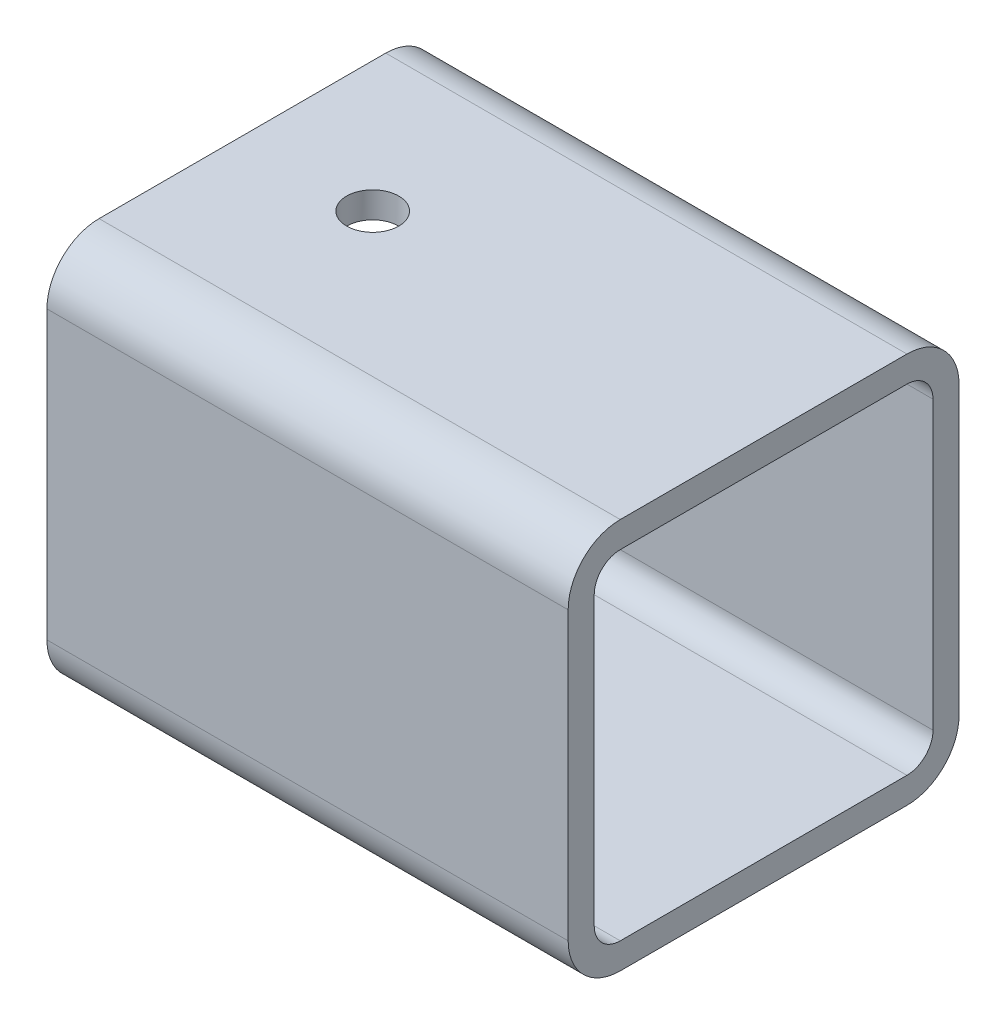
ISO-10303-21;
HEADER;
FILE_DESCRIPTION(('STEP AP214'),'2;1');
FILE_NAME('part.step','',(''),(''),'','','');
FILE_SCHEMA(('AUTOMOTIVE_DESIGN { 1 0 10303 214 1 1 1 1 }'));
ENDSEC;
DATA;
#1=APPLICATION_CONTEXT('core data for automotive mechanical design processes');
#2=APPLICATION_PROTOCOL_DEFINITION('international standard','automotive_design',2000,#1);
#3=PRODUCT_CONTEXT('',#1,'mechanical');
#4=PRODUCT('Part','Part','',(#3));
#5=PRODUCT_RELATED_PRODUCT_CATEGORY('part','',(#4));
#6=PRODUCT_DEFINITION_FORMATION('','',#4);
#7=PRODUCT_DEFINITION_CONTEXT('part definition',#1,'design');
#8=PRODUCT_DEFINITION('design','',#6,#7);
#9=PRODUCT_DEFINITION_SHAPE('','',#8);
#10=(LENGTH_UNIT() NAMED_UNIT(*) SI_UNIT(.MILLI.,.METRE.));
#11=(NAMED_UNIT(*) PLANE_ANGLE_UNIT() SI_UNIT($,.RADIAN.));
#12=(NAMED_UNIT(*) SI_UNIT($,.STERADIAN.) SOLID_ANGLE_UNIT());
#13=UNCERTAINTY_MEASURE_WITH_UNIT(LENGTH_MEASURE(1.E-05),#10,'distance_accuracy_value','');
#14=(GEOMETRIC_REPRESENTATION_CONTEXT(3) GLOBAL_UNCERTAINTY_ASSIGNED_CONTEXT((#13)) GLOBAL_UNIT_ASSIGNED_CONTEXT((#10,
#11,#12)) REPRESENTATION_CONTEXT('',''));
#15=CARTESIAN_POINT('',(0.,0.,0.));
#16=DIRECTION('',(0.,0.,1.));
#17=DIRECTION('',(1.,0.,0.));
#18=AXIS2_PLACEMENT_3D('',#15,#16,#17);
#19=CARTESIAN_POINT('',(20.,-11.,11.));
#20=DIRECTION('',(-1.,0.,0.));
#21=DIRECTION('',(0.,0.,1.));
#22=AXIS2_PLACEMENT_3D('',#19,#20,#21);
#23=PLANE('',#22);
#24=CARTESIAN_POINT('',(20.,-11.,11.));
#25=DIRECTION('',(1.,0.,0.));
#26=DIRECTION('',(0.,0.,1.));
#27=AXIS2_PLACEMENT_3D('',#24,#25,#26);
#28=CIRCLE('',#27,4.);
#29=CARTESIAN_POINT('',(20.,-11.,15.));
#30=VERTEX_POINT('',#29);
#31=CARTESIAN_POINT('',(20.,-15.,11.));
#32=VERTEX_POINT('',#31);
#33=EDGE_CURVE('E216',#30,#32,#28,.T.);
#34=ORIENTED_EDGE('',*,*,#33,.T.);
#35=DIRECTION('',(0.,0.,-1.));
#36=VECTOR('',#35,1.);
#37=CARTESIAN_POINT('',(20.,-15.,11.));
#38=LINE('',#37,#36);
#39=CARTESIAN_POINT('',(20.,-15.,-11.));
#40=VERTEX_POINT('',#39);
#41=EDGE_CURVE('E219',#32,#40,#38,.T.);
#42=ORIENTED_EDGE('',*,*,#41,.T.);
#43=CARTESIAN_POINT('',(20.,-11.,-11.));
#44=DIRECTION('',(1.,0.,0.));
#45=DIRECTION('',(0.,0.,-1.));
#46=AXIS2_PLACEMENT_3D('',#43,#44,#45);
#47=CIRCLE('',#46,4.);
#48=CARTESIAN_POINT('',(20.,-11.,-15.));
#49=VERTEX_POINT('',#48);
#50=EDGE_CURVE('E222',#40,#49,#47,.T.);
#51=ORIENTED_EDGE('',*,*,#50,.T.);
#52=DIRECTION('',(0.,1.,0.));
#53=VECTOR('',#52,1.);
#54=CARTESIAN_POINT('',(20.,-11.,-15.));
#55=LINE('',#54,#53);
#56=CARTESIAN_POINT('',(20.,11.,-15.));
#57=VERTEX_POINT('',#56);
#58=EDGE_CURVE('E224',#49,#57,#55,.T.);
#59=ORIENTED_EDGE('',*,*,#58,.T.);
#60=CARTESIAN_POINT('',(20.,11.,-11.));
#61=DIRECTION('',(1.,0.,0.));
#62=DIRECTION('',(0.,0.,1.));
#63=AXIS2_PLACEMENT_3D('',#60,#61,#62);
#64=CIRCLE('',#63,4.);
#65=CARTESIAN_POINT('',(20.,15.,-11.));
#66=VERTEX_POINT('',#65);
#67=EDGE_CURVE('E226',#57,#66,#64,.T.);
#68=ORIENTED_EDGE('',*,*,#67,.T.);
#69=DIRECTION('',(0.,0.,1.));
#70=VECTOR('',#69,1.);
#71=CARTESIAN_POINT('',(20.,15.,11.));
#72=LINE('',#71,#70);
#73=CARTESIAN_POINT('',(20.,15.,11.));
#74=VERTEX_POINT('',#73);
#75=EDGE_CURVE('E228',#66,#74,#72,.T.);
#76=ORIENTED_EDGE('',*,*,#75,.T.);
#77=CARTESIAN_POINT('',(20.,11.,11.));
#78=DIRECTION('',(1.,0.,0.));
#79=DIRECTION('',(0.,0.,1.));
#80=AXIS2_PLACEMENT_3D('',#77,#78,#79);
#81=CIRCLE('',#80,4.);
#82=CARTESIAN_POINT('',(20.,11.,15.));
#83=VERTEX_POINT('',#82);
#84=EDGE_CURVE('E230',#74,#83,#81,.T.);
#85=ORIENTED_EDGE('',*,*,#84,.T.);
#86=DIRECTION('',(0.,-1.,0.));
#87=VECTOR('',#86,1.);
#88=CARTESIAN_POINT('',(20.,-11.,15.));
#89=LINE('',#88,#87);
#90=EDGE_CURVE('E232',#83,#30,#89,.T.);
#91=ORIENTED_EDGE('',*,*,#90,.T.);
#92=EDGE_LOOP('',(#34,#42,#51,#59,#68,#76,#85,#91));
#93=FACE_BOUND('',#92,.T.);
#94=CARTESIAN_POINT('',(20.,-11.,11.));
#95=DIRECTION('',(1.,0.,0.));
#96=DIRECTION('',(0.,0.,1.));
#97=AXIS2_PLACEMENT_3D('',#94,#95,#96);
#98=CIRCLE('',#97,2.);
#99=CARTESIAN_POINT('',(20.,-11.,13.));
#100=VERTEX_POINT('',#99);
#101=CARTESIAN_POINT('',(20.,-13.,11.));
#102=VERTEX_POINT('',#101);
#103=EDGE_CURVE('E149',#100,#102,#98,.T.);
#104=ORIENTED_EDGE('',*,*,#103,.F.);
#105=DIRECTION('',(0.,-1.,0.));
#106=VECTOR('',#105,1.);
#107=CARTESIAN_POINT('',(20.,-11.,13.));
#108=LINE('',#107,#106);
#109=CARTESIAN_POINT('',(20.,11.,13.));
#110=VERTEX_POINT('',#109);
#111=EDGE_CURVE('E183',#110,#100,#108,.T.);
#112=ORIENTED_EDGE('',*,*,#111,.F.);
#113=CARTESIAN_POINT('',(20.,11.,11.));
#114=DIRECTION('',(1.,0.,0.));
#115=DIRECTION('',(0.,0.,1.));
#116=AXIS2_PLACEMENT_3D('',#113,#114,#115);
#117=CIRCLE('',#116,2.);
#118=CARTESIAN_POINT('',(20.,13.,11.));
#119=VERTEX_POINT('',#118);
#120=EDGE_CURVE('E181',#119,#110,#117,.T.);
#121=ORIENTED_EDGE('',*,*,#120,.F.);
#122=DIRECTION('',(0.,0.,1.));
#123=VECTOR('',#122,1.);
#124=CARTESIAN_POINT('',(20.,13.,11.));
#125=LINE('',#124,#123);
#126=CARTESIAN_POINT('',(20.,13.,-11.));
#127=VERTEX_POINT('',#126);
#128=EDGE_CURVE('E179',#127,#119,#125,.T.);
#129=ORIENTED_EDGE('',*,*,#128,.F.);
#130=CARTESIAN_POINT('',(20.,11.,-11.));
#131=DIRECTION('',(1.,0.,0.));
#132=DIRECTION('',(0.,0.,1.));
#133=AXIS2_PLACEMENT_3D('',#130,#131,#132);
#134=CIRCLE('',#133,2.);
#135=CARTESIAN_POINT('',(20.,11.,-13.));
#136=VERTEX_POINT('',#135);
#137=EDGE_CURVE('E177',#136,#127,#134,.T.);
#138=ORIENTED_EDGE('',*,*,#137,.F.);
#139=DIRECTION('',(0.,1.,0.));
#140=VECTOR('',#139,1.);
#141=CARTESIAN_POINT('',(20.,-11.,-13.));
#142=LINE('',#141,#140);
#143=CARTESIAN_POINT('',(20.,-11.,-13.));
#144=VERTEX_POINT('',#143);
#145=EDGE_CURVE('E172',#144,#136,#142,.T.);
#146=ORIENTED_EDGE('',*,*,#145,.F.);
#147=CARTESIAN_POINT('',(20.,-11.,-11.));
#148=DIRECTION('',(1.,0.,0.));
#149=DIRECTION('',(0.,0.,-1.));
#150=AXIS2_PLACEMENT_3D('',#147,#148,#149);
#151=CIRCLE('',#150,2.);
#152=CARTESIAN_POINT('',(20.,-13.,-11.));
#153=VERTEX_POINT('',#152);
#154=EDGE_CURVE('E170',#153,#144,#151,.T.);
#155=ORIENTED_EDGE('',*,*,#154,.F.);
#156=DIRECTION('',(0.,0.,-1.));
#157=VECTOR('',#156,1.);
#158=CARTESIAN_POINT('',(20.,-13.,11.));
#159=LINE('',#158,#157);
#160=EDGE_CURVE('E157',#102,#153,#159,.T.);
#161=ORIENTED_EDGE('',*,*,#160,.F.);
#162=EDGE_LOOP('',(#104,#112,#121,#129,#138,#146,#155,#161));
#163=FACE_BOUND('',#162,.T.);
#164=ADVANCED_FACE('F35',(#93,#163),#23,.F.);
#165=CARTESIAN_POINT('',(-20.,-11.,11.));
#166=DIRECTION('',(-1.,0.,0.));
#167=DIRECTION('',(0.,0.,1.));
#168=AXIS2_PLACEMENT_3D('',#165,#166,#167);
#169=PLANE('',#168);
#170=CARTESIAN_POINT('',(-20.,-11.,11.));
#171=DIRECTION('',(1.,0.,0.));
#172=DIRECTION('',(0.,0.,1.));
#173=AXIS2_PLACEMENT_3D('',#170,#171,#172);
#174=CIRCLE('',#173,4.);
#175=CARTESIAN_POINT('',(-20.,-11.,15.));
#176=VERTEX_POINT('',#175);
#177=CARTESIAN_POINT('',(-20.,-15.,11.));
#178=VERTEX_POINT('',#177);
#179=EDGE_CURVE('E165',#176,#178,#174,.T.);
#180=ORIENTED_EDGE('',*,*,#179,.F.);
#181=DIRECTION('',(0.,-1.,0.));
#182=VECTOR('',#181,1.);
#183=CARTESIAN_POINT('',(-20.,-11.,15.));
#184=LINE('',#183,#182);
#185=CARTESIAN_POINT('',(-20.,11.,15.));
#186=VERTEX_POINT('',#185);
#187=EDGE_CURVE('E220',#186,#176,#184,.T.);
#188=ORIENTED_EDGE('',*,*,#187,.F.);
#189=CARTESIAN_POINT('',(-20.,11.,11.));
#190=DIRECTION('',(1.,0.,0.));
#191=DIRECTION('',(0.,0.,1.));
#192=AXIS2_PLACEMENT_3D('',#189,#190,#191);
#193=CIRCLE('',#192,4.);
#194=CARTESIAN_POINT('',(-20.,15.,11.));
#195=VERTEX_POINT('',#194);
#196=EDGE_CURVE('E247',#195,#186,#193,.T.);
#197=ORIENTED_EDGE('',*,*,#196,.F.);
#198=DIRECTION('',(0.,0.,1.));
#199=VECTOR('',#198,1.);
#200=CARTESIAN_POINT('',(-20.,15.,11.));
#201=LINE('',#200,#199);
#202=CARTESIAN_POINT('',(-20.,15.,-11.));
#203=VERTEX_POINT('',#202);
#204=EDGE_CURVE('E245',#203,#195,#201,.T.);
#205=ORIENTED_EDGE('',*,*,#204,.F.);
#206=CARTESIAN_POINT('',(-20.,11.,-11.));
#207=DIRECTION('',(1.,0.,0.));
#208=DIRECTION('',(0.,0.,1.));
#209=AXIS2_PLACEMENT_3D('',#206,#207,#208);
#210=CIRCLE('',#209,4.);
#211=CARTESIAN_POINT('',(-20.,11.,-15.));
#212=VERTEX_POINT('',#211);
#213=EDGE_CURVE('E243',#212,#203,#210,.T.);
#214=ORIENTED_EDGE('',*,*,#213,.F.);
#215=DIRECTION('',(0.,1.,0.));
#216=VECTOR('',#215,1.);
#217=CARTESIAN_POINT('',(-20.,-11.,-15.));
#218=LINE('',#217,#216);
#219=CARTESIAN_POINT('',(-20.,-11.,-15.));
#220=VERTEX_POINT('',#219);
#221=EDGE_CURVE('E241',#220,#212,#218,.T.);
#222=ORIENTED_EDGE('',*,*,#221,.F.);
#223=CARTESIAN_POINT('',(-20.,-11.,-11.));
#224=DIRECTION('',(1.,0.,0.));
#225=DIRECTION('',(0.,0.,-1.));
#226=AXIS2_PLACEMENT_3D('',#223,#224,#225);
#227=CIRCLE('',#226,4.);
#228=CARTESIAN_POINT('',(-20.,-15.,-11.));
#229=VERTEX_POINT('',#228);
#230=EDGE_CURVE('E239',#229,#220,#227,.T.);
#231=ORIENTED_EDGE('',*,*,#230,.F.);
#232=DIRECTION('',(0.,0.,-1.));
#233=VECTOR('',#232,1.);
#234=CARTESIAN_POINT('',(-20.,-15.,11.));
#235=LINE('',#234,#233);
#236=EDGE_CURVE('E237',#178,#229,#235,.T.);
#237=ORIENTED_EDGE('',*,*,#236,.F.);
#238=EDGE_LOOP('',(#180,#188,#197,#205,#214,#222,#231,#237));
#239=FACE_BOUND('',#238,.T.);
#240=DIRECTION('',(0.,-1.,0.));
#241=VECTOR('',#240,1.);
#242=CARTESIAN_POINT('',(-20.,-11.,13.));
#243=LINE('',#242,#241);
#244=CARTESIAN_POINT('',(-20.,11.,13.));
#245=VERTEX_POINT('',#244);
#246=CARTESIAN_POINT('',(-20.,-11.,13.));
#247=VERTEX_POINT('',#246);
#248=EDGE_CURVE('E158',#245,#247,#243,.T.);
#249=ORIENTED_EDGE('',*,*,#248,.T.);
#250=CARTESIAN_POINT('',(-20.,-11.,11.));
#251=DIRECTION('',(1.,0.,0.));
#252=DIRECTION('',(0.,0.,1.));
#253=AXIS2_PLACEMENT_3D('',#250,#251,#252);
#254=CIRCLE('',#253,2.);
#255=CARTESIAN_POINT('',(-20.,-13.,11.));
#256=VERTEX_POINT('',#255);
#257=EDGE_CURVE('E59',#247,#256,#254,.T.);
#258=ORIENTED_EDGE('',*,*,#257,.T.);
#259=DIRECTION('',(0.,0.,-1.));
#260=VECTOR('',#259,1.);
#261=CARTESIAN_POINT('',(-20.,-13.,11.));
#262=LINE('',#261,#260);
#263=CARTESIAN_POINT('',(-20.,-13.,-11.));
#264=VERTEX_POINT('',#263);
#265=EDGE_CURVE('E164',#256,#264,#262,.T.);
#266=ORIENTED_EDGE('',*,*,#265,.T.);
#267=CARTESIAN_POINT('',(-20.,-11.,-11.));
#268=DIRECTION('',(1.,0.,0.));
#269=DIRECTION('',(0.,0.,-1.));
#270=AXIS2_PLACEMENT_3D('',#267,#268,#269);
#271=CIRCLE('',#270,2.);
#272=CARTESIAN_POINT('',(-20.,-11.,-13.));
#273=VERTEX_POINT('',#272);
#274=EDGE_CURVE('E188',#264,#273,#271,.T.);
#275=ORIENTED_EDGE('',*,*,#274,.T.);
#276=DIRECTION('',(0.,1.,0.));
#277=VECTOR('',#276,1.);
#278=CARTESIAN_POINT('',(-20.,-11.,-13.));
#279=LINE('',#278,#277);
#280=CARTESIAN_POINT('',(-20.,11.,-13.));
#281=VERTEX_POINT('',#280);
#282=EDGE_CURVE('E191',#273,#281,#279,.T.);
#283=ORIENTED_EDGE('',*,*,#282,.T.);
#284=CARTESIAN_POINT('',(-20.,11.,-11.));
#285=DIRECTION('',(1.,0.,0.));
#286=DIRECTION('',(0.,0.,1.));
#287=AXIS2_PLACEMENT_3D('',#284,#285,#286);
#288=CIRCLE('',#287,2.);
#289=CARTESIAN_POINT('',(-20.,13.,-11.));
#290=VERTEX_POINT('',#289);
#291=EDGE_CURVE('E194',#281,#290,#288,.T.);
#292=ORIENTED_EDGE('',*,*,#291,.T.);
#293=DIRECTION('',(0.,0.,1.));
#294=VECTOR('',#293,1.);
#295=CARTESIAN_POINT('',(-20.,13.,11.));
#296=LINE('',#295,#294);
#297=CARTESIAN_POINT('',(-20.,13.,11.));
#298=VERTEX_POINT('',#297);
#299=EDGE_CURVE('E197',#290,#298,#296,.T.);
#300=ORIENTED_EDGE('',*,*,#299,.T.);
#301=CARTESIAN_POINT('',(-20.,11.,11.));
#302=DIRECTION('',(1.,0.,0.));
#303=DIRECTION('',(0.,0.,1.));
#304=AXIS2_PLACEMENT_3D('',#301,#302,#303);
#305=CIRCLE('',#304,2.);
#306=EDGE_CURVE('E200',#298,#245,#305,.T.);
#307=ORIENTED_EDGE('',*,*,#306,.T.);
#308=EDGE_LOOP('',(#249,#258,#266,#275,#283,#292,#300,#307));
#309=FACE_BOUND('',#308,.T.);
#310=ADVANCED_FACE('F278',(#239,#309),#169,.T.);
#311=CARTESIAN_POINT('',(20.,-11.,11.));
#312=DIRECTION('',(-1.,0.,0.));
#313=DIRECTION('',(0.,0.,1.));
#314=AXIS2_PLACEMENT_3D('',#311,#312,#313);
#315=CYLINDRICAL_SURFACE('',#314,4.);
#316=ORIENTED_EDGE('',*,*,#179,.T.);
#317=DIRECTION('',(-1.,0.,0.));
#318=VECTOR('',#317,1.);
#319=CARTESIAN_POINT('',(20.,-15.,11.));
#320=LINE('',#319,#318);
#321=EDGE_CURVE('E11',#32,#178,#320,.T.);
#322=ORIENTED_EDGE('',*,*,#321,.F.);
#323=ORIENTED_EDGE('',*,*,#33,.F.);
#324=DIRECTION('',(-1.,0.,0.));
#325=VECTOR('',#324,1.);
#326=CARTESIAN_POINT('',(20.,-11.,15.));
#327=LINE('',#326,#325);
#328=EDGE_CURVE('E234',#30,#176,#327,.T.);
#329=ORIENTED_EDGE('',*,*,#328,.T.);
#330=EDGE_LOOP('',(#316,#322,#323,#329));
#331=FACE_BOUND('',#330,.T.);
#332=ADVANCED_FACE('F37',(#331),#315,.T.);
#333=CARTESIAN_POINT('',(20.,-15.,11.));
#334=DIRECTION('',(0.,1.,0.));
#335=DIRECTION('',(0.,0.,1.));
#336=AXIS2_PLACEMENT_3D('',#333,#334,#335);
#337=PLANE('',#336);
#338=CARTESIAN_POINT('',(-10.,-15.,0.));
#339=DIRECTION('',(0.,1.,0.));
#340=DIRECTION('',(0.,0.,1.));
#341=AXIS2_PLACEMENT_3D('',#338,#339,#340);
#342=CIRCLE('',#341,2.);
#343=CARTESIAN_POINT('',(-10.,-15.,2.));
#344=VERTEX_POINT('',#343);
#345=EDGE_CURVE('E376',#344,#344,#342,.T.);
#346=ORIENTED_EDGE('',*,*,#345,.T.);
#347=EDGE_LOOP('',(#346));
#348=FACE_BOUND('',#347,.T.);
#349=ORIENTED_EDGE('',*,*,#236,.T.);
#350=DIRECTION('',(-1.,0.,0.));
#351=VECTOR('',#350,1.);
#352=CARTESIAN_POINT('',(20.,-15.,-11.));
#353=LINE('',#352,#351);
#354=EDGE_CURVE('E44',#40,#229,#353,.T.);
#355=ORIENTED_EDGE('',*,*,#354,.F.);
#356=ORIENTED_EDGE('',*,*,#41,.F.);
#357=ORIENTED_EDGE('',*,*,#321,.T.);
#358=EDGE_LOOP('',(#349,#355,#356,#357));
#359=FACE_BOUND('',#358,.T.);
#360=ADVANCED_FACE('F295',(#348,#359),#337,.F.);
#361=CARTESIAN_POINT('',(20.,-11.,-11.));
#362=DIRECTION('',(-1.,0.,0.));
#363=DIRECTION('',(0.,0.,1.));
#364=AXIS2_PLACEMENT_3D('',#361,#362,#363);
#365=CYLINDRICAL_SURFACE('',#364,4.);
#366=ORIENTED_EDGE('',*,*,#230,.T.);
#367=DIRECTION('',(-1.,0.,0.));
#368=VECTOR('',#367,1.);
#369=CARTESIAN_POINT('',(20.,-11.,-15.));
#370=LINE('',#369,#368);
#371=EDGE_CURVE('E264',#49,#220,#370,.T.);
#372=ORIENTED_EDGE('',*,*,#371,.F.);
#373=ORIENTED_EDGE('',*,*,#50,.F.);
#374=ORIENTED_EDGE('',*,*,#354,.T.);
#375=EDGE_LOOP('',(#366,#372,#373,#374));
#376=FACE_BOUND('',#375,.T.);
#377=ADVANCED_FACE('F272',(#376),#365,.T.);
#378=CARTESIAN_POINT('',(20.,-11.,-15.));
#379=DIRECTION('',(0.,0.,1.));
#380=DIRECTION('',(0.,-1.,0.));
#381=AXIS2_PLACEMENT_3D('',#378,#379,#380);
#382=PLANE('',#381);
#383=ORIENTED_EDGE('',*,*,#221,.T.);
#384=DIRECTION('',(-1.,0.,0.));
#385=VECTOR('',#384,1.);
#386=CARTESIAN_POINT('',(20.,11.,-15.));
#387=LINE('',#386,#385);
#388=EDGE_CURVE('E261',#57,#212,#387,.T.);
#389=ORIENTED_EDGE('',*,*,#388,.F.);
#390=ORIENTED_EDGE('',*,*,#58,.F.);
#391=ORIENTED_EDGE('',*,*,#371,.T.);
#392=EDGE_LOOP('',(#383,#389,#390,#391));
#393=FACE_BOUND('',#392,.T.);
#394=ADVANCED_FACE('F284',(#393),#382,.F.);
#395=CARTESIAN_POINT('',(20.,11.,-11.));
#396=DIRECTION('',(-1.,0.,0.));
#397=DIRECTION('',(0.,0.,1.));
#398=AXIS2_PLACEMENT_3D('',#395,#396,#397);
#399=CYLINDRICAL_SURFACE('',#398,4.);
#400=ORIENTED_EDGE('',*,*,#213,.T.);
#401=DIRECTION('',(-1.,0.,0.));
#402=VECTOR('',#401,1.);
#403=CARTESIAN_POINT('',(20.,15.,-11.));
#404=LINE('',#403,#402);
#405=EDGE_CURVE('E258',#66,#203,#404,.T.);
#406=ORIENTED_EDGE('',*,*,#405,.F.);
#407=ORIENTED_EDGE('',*,*,#67,.F.);
#408=ORIENTED_EDGE('',*,*,#388,.T.);
#409=EDGE_LOOP('',(#400,#406,#407,#408));
#410=FACE_BOUND('',#409,.T.);
#411=ADVANCED_FACE('F288',(#410),#399,.T.);
#412=CARTESIAN_POINT('',(20.,15.,11.));
#413=DIRECTION('',(0.,-1.,0.));
#414=DIRECTION('',(0.,0.,-1.));
#415=AXIS2_PLACEMENT_3D('',#412,#413,#414);
#416=PLANE('',#415);
#417=CARTESIAN_POINT('',(-10.,15.,0.));
#418=DIRECTION('',(0.,1.,0.));
#419=DIRECTION('',(0.,0.,1.));
#420=AXIS2_PLACEMENT_3D('',#417,#418,#419);
#421=CIRCLE('',#420,2.);
#422=CARTESIAN_POINT('',(-10.,15.,2.));
#423=VERTEX_POINT('',#422);
#424=EDGE_CURVE('E375',#423,#423,#421,.T.);
#425=ORIENTED_EDGE('',*,*,#424,.F.);
#426=EDGE_LOOP('',(#425));
#427=FACE_BOUND('',#426,.T.);
#428=ORIENTED_EDGE('',*,*,#204,.T.);
#429=DIRECTION('',(-1.,0.,0.));
#430=VECTOR('',#429,1.);
#431=CARTESIAN_POINT('',(20.,15.,11.));
#432=LINE('',#431,#430);
#433=EDGE_CURVE('E255',#74,#195,#432,.T.);
#434=ORIENTED_EDGE('',*,*,#433,.F.);
#435=ORIENTED_EDGE('',*,*,#75,.F.);
#436=ORIENTED_EDGE('',*,*,#405,.T.);
#437=EDGE_LOOP('',(#428,#434,#435,#436));
#438=FACE_BOUND('',#437,.T.);
#439=ADVANCED_FACE('F308',(#427,#438),#416,.F.);
#440=CARTESIAN_POINT('',(20.,11.,11.));
#441=DIRECTION('',(-1.,0.,0.));
#442=DIRECTION('',(0.,0.,1.));
#443=AXIS2_PLACEMENT_3D('',#440,#441,#442);
#444=CYLINDRICAL_SURFACE('',#443,4.);
#445=ORIENTED_EDGE('',*,*,#196,.T.);
#446=DIRECTION('',(-1.,0.,0.));
#447=VECTOR('',#446,1.);
#448=CARTESIAN_POINT('',(20.,11.,15.));
#449=LINE('',#448,#447);
#450=EDGE_CURVE('E252',#83,#186,#449,.T.);
#451=ORIENTED_EDGE('',*,*,#450,.F.);
#452=ORIENTED_EDGE('',*,*,#84,.F.);
#453=ORIENTED_EDGE('',*,*,#433,.T.);
#454=EDGE_LOOP('',(#445,#451,#452,#453));
#455=FACE_BOUND('',#454,.T.);
#456=ADVANCED_FACE('F306',(#455),#444,.T.);
#457=CARTESIAN_POINT('',(20.,-11.,15.));
#458=DIRECTION('',(0.,0.,-1.));
#459=DIRECTION('',(-1.,0.,0.));
#460=AXIS2_PLACEMENT_3D('',#457,#458,#459);
#461=PLANE('',#460);
#462=ORIENTED_EDGE('',*,*,#187,.T.);
#463=ORIENTED_EDGE('',*,*,#328,.F.);
#464=ORIENTED_EDGE('',*,*,#90,.F.);
#465=ORIENTED_EDGE('',*,*,#450,.T.);
#466=EDGE_LOOP('',(#462,#463,#464,#465));
#467=FACE_BOUND('',#466,.T.);
#468=ADVANCED_FACE('F301',(#467),#461,.F.);
#469=CARTESIAN_POINT('',(20.,-11.,11.));
#470=DIRECTION('',(-1.,0.,0.));
#471=DIRECTION('',(0.,0.,1.));
#472=AXIS2_PLACEMENT_3D('',#469,#470,#471);
#473=CYLINDRICAL_SURFACE('',#472,2.);
#474=ORIENTED_EDGE('',*,*,#257,.F.);
#475=DIRECTION('',(-1.,0.,0.));
#476=VECTOR('',#475,1.);
#477=CARTESIAN_POINT('',(20.,-11.,13.));
#478=LINE('',#477,#476);
#479=EDGE_CURVE('E153',#100,#247,#478,.T.);
#480=ORIENTED_EDGE('',*,*,#479,.F.);
#481=ORIENTED_EDGE('',*,*,#103,.T.);
#482=DIRECTION('',(-1.,0.,0.));
#483=VECTOR('',#482,1.);
#484=CARTESIAN_POINT('',(20.,-13.,11.));
#485=LINE('',#484,#483);
#486=EDGE_CURVE('E152',#102,#256,#485,.T.);
#487=ORIENTED_EDGE('',*,*,#486,.T.);
#488=EDGE_LOOP('',(#474,#480,#481,#487));
#489=FACE_BOUND('',#488,.T.);
#490=ADVANCED_FACE('F151',(#489),#473,.F.);
#491=CARTESIAN_POINT('',(20.,-13.,11.));
#492=DIRECTION('',(0.,1.,0.));
#493=DIRECTION('',(0.,0.,1.));
#494=AXIS2_PLACEMENT_3D('',#491,#492,#493);
#495=PLANE('',#494);
#496=CARTESIAN_POINT('',(-10.,-13.,0.));
#497=DIRECTION('',(0.,1.,0.));
#498=DIRECTION('',(0.,0.,1.));
#499=AXIS2_PLACEMENT_3D('',#496,#497,#498);
#500=CIRCLE('',#499,2.);
#501=CARTESIAN_POINT('',(-10.,-13.,2.));
#502=VERTEX_POINT('',#501);
#503=EDGE_CURVE('E186',#502,#502,#500,.T.);
#504=ORIENTED_EDGE('',*,*,#503,.F.);
#505=EDGE_LOOP('',(#504));
#506=FACE_BOUND('',#505,.T.);
#507=ORIENTED_EDGE('',*,*,#265,.F.);
#508=ORIENTED_EDGE('',*,*,#486,.F.);
#509=ORIENTED_EDGE('',*,*,#160,.T.);
#510=DIRECTION('',(-1.,0.,0.));
#511=VECTOR('',#510,1.);
#512=CARTESIAN_POINT('',(20.,-13.,-11.));
#513=LINE('',#512,#511);
#514=EDGE_CURVE('E166',#153,#264,#513,.T.);
#515=ORIENTED_EDGE('',*,*,#514,.T.);
#516=EDGE_LOOP('',(#507,#508,#509,#515));
#517=FACE_BOUND('',#516,.T.);
#518=ADVANCED_FACE('F161',(#506,#517),#495,.T.);
#519=CARTESIAN_POINT('',(20.,-11.,-11.));
#520=DIRECTION('',(-1.,0.,0.));
#521=DIRECTION('',(0.,0.,1.));
#522=AXIS2_PLACEMENT_3D('',#519,#520,#521);
#523=CYLINDRICAL_SURFACE('',#522,2.);
#524=ORIENTED_EDGE('',*,*,#274,.F.);
#525=ORIENTED_EDGE('',*,*,#514,.F.);
#526=ORIENTED_EDGE('',*,*,#154,.T.);
#527=DIRECTION('',(-1.,0.,0.));
#528=VECTOR('',#527,1.);
#529=CARTESIAN_POINT('',(20.,-11.,-13.));
#530=LINE('',#529,#528);
#531=EDGE_CURVE('E213',#144,#273,#530,.T.);
#532=ORIENTED_EDGE('',*,*,#531,.T.);
#533=EDGE_LOOP('',(#524,#525,#526,#532));
#534=FACE_BOUND('',#533,.T.);
#535=ADVANCED_FACE('F335',(#534),#523,.F.);
#536=CARTESIAN_POINT('',(20.,-11.,-13.));
#537=DIRECTION('',(0.,0.,1.));
#538=DIRECTION('',(1.,0.,0.));
#539=AXIS2_PLACEMENT_3D('',#536,#537,#538);
#540=PLANE('',#539);
#541=ORIENTED_EDGE('',*,*,#282,.F.);
#542=ORIENTED_EDGE('',*,*,#531,.F.);
#543=ORIENTED_EDGE('',*,*,#145,.T.);
#544=DIRECTION('',(-1.,0.,0.));
#545=VECTOR('',#544,1.);
#546=CARTESIAN_POINT('',(20.,11.,-13.));
#547=LINE('',#546,#545);
#548=EDGE_CURVE('E211',#136,#281,#547,.T.);
#549=ORIENTED_EDGE('',*,*,#548,.T.);
#550=EDGE_LOOP('',(#541,#542,#543,#549));
#551=FACE_BOUND('',#550,.T.);
#552=ADVANCED_FACE('F340',(#551),#540,.T.);
#553=CARTESIAN_POINT('',(20.,11.,-11.));
#554=DIRECTION('',(-1.,0.,0.));
#555=DIRECTION('',(0.,0.,1.));
#556=AXIS2_PLACEMENT_3D('',#553,#554,#555);
#557=CYLINDRICAL_SURFACE('',#556,2.);
#558=ORIENTED_EDGE('',*,*,#291,.F.);
#559=ORIENTED_EDGE('',*,*,#548,.F.);
#560=ORIENTED_EDGE('',*,*,#137,.T.);
#561=DIRECTION('',(-1.,0.,0.));
#562=VECTOR('',#561,1.);
#563=CARTESIAN_POINT('',(20.,13.,-11.));
#564=LINE('',#563,#562);
#565=EDGE_CURVE('E209',#127,#290,#564,.T.);
#566=ORIENTED_EDGE('',*,*,#565,.T.);
#567=EDGE_LOOP('',(#558,#559,#560,#566));
#568=FACE_BOUND('',#567,.T.);
#569=ADVANCED_FACE('F347',(#568),#557,.F.);
#570=CARTESIAN_POINT('',(20.,13.,11.));
#571=DIRECTION('',(0.,-1.,0.));
#572=DIRECTION('',(0.,0.,-1.));
#573=AXIS2_PLACEMENT_3D('',#570,#571,#572);
#574=PLANE('',#573);
#575=CARTESIAN_POINT('',(-10.,13.,0.));
#576=DIRECTION('',(0.,-1.,0.));
#577=DIRECTION('',(0.,0.,-1.));
#578=AXIS2_PLACEMENT_3D('',#575,#576,#577);
#579=CIRCLE('',#578,2.);
#580=CARTESIAN_POINT('',(-10.,13.,-2.));
#581=VERTEX_POINT('',#580);
#582=EDGE_CURVE('E39',#581,#581,#579,.T.);
#583=ORIENTED_EDGE('',*,*,#582,.F.);
#584=EDGE_LOOP('',(#583));
#585=FACE_BOUND('',#584,.T.);
#586=ORIENTED_EDGE('',*,*,#299,.F.);
#587=ORIENTED_EDGE('',*,*,#565,.F.);
#588=ORIENTED_EDGE('',*,*,#128,.T.);
#589=DIRECTION('',(-1.,0.,0.));
#590=VECTOR('',#589,1.);
#591=CARTESIAN_POINT('',(20.,13.,11.));
#592=LINE('',#591,#590);
#593=EDGE_CURVE('E207',#119,#298,#592,.T.);
#594=ORIENTED_EDGE('',*,*,#593,.T.);
#595=EDGE_LOOP('',(#586,#587,#588,#594));
#596=FACE_BOUND('',#595,.T.);
#597=ADVANCED_FACE('F351',(#585,#596),#574,.T.);
#598=CARTESIAN_POINT('',(20.,11.,11.));
#599=DIRECTION('',(-1.,0.,0.));
#600=DIRECTION('',(0.,0.,1.));
#601=AXIS2_PLACEMENT_3D('',#598,#599,#600);
#602=CYLINDRICAL_SURFACE('',#601,2.);
#603=ORIENTED_EDGE('',*,*,#306,.F.);
#604=ORIENTED_EDGE('',*,*,#593,.F.);
#605=ORIENTED_EDGE('',*,*,#120,.T.);
#606=DIRECTION('',(-1.,0.,0.));
#607=VECTOR('',#606,1.);
#608=CARTESIAN_POINT('',(20.,11.,13.));
#609=LINE('',#608,#607);
#610=EDGE_CURVE('E51',#110,#245,#609,.T.);
#611=ORIENTED_EDGE('',*,*,#610,.T.);
#612=EDGE_LOOP('',(#603,#604,#605,#611));
#613=FACE_BOUND('',#612,.T.);
#614=ADVANCED_FACE('F355',(#613),#602,.F.);
#615=CARTESIAN_POINT('',(20.,-11.,13.));
#616=DIRECTION('',(0.,0.,-1.));
#617=DIRECTION('',(0.,1.,0.));
#618=AXIS2_PLACEMENT_3D('',#615,#616,#617);
#619=PLANE('',#618);
#620=ORIENTED_EDGE('',*,*,#248,.F.);
#621=ORIENTED_EDGE('',*,*,#610,.F.);
#622=ORIENTED_EDGE('',*,*,#111,.T.);
#623=ORIENTED_EDGE('',*,*,#479,.T.);
#624=EDGE_LOOP('',(#620,#621,#622,#623));
#625=FACE_BOUND('',#624,.T.);
#626=ADVANCED_FACE('F359',(#625),#619,.T.);
#627=CARTESIAN_POINT('',(-10.,-15.,0.));
#628=DIRECTION('',(0.,1.,0.));
#629=DIRECTION('',(0.,0.,1.));
#630=AXIS2_PLACEMENT_3D('',#627,#628,#629);
#631=CYLINDRICAL_SURFACE('',#630,2.);
#632=ORIENTED_EDGE('',*,*,#582,.T.);
#633=EDGE_LOOP('',(#632));
#634=FACE_BOUND('',#633,.T.);
#635=ORIENTED_EDGE('',*,*,#424,.T.);
#636=EDGE_LOOP('',(#635));
#637=FACE_BOUND('',#636,.T.);
#638=ADVANCED_FACE('F363',(#634,#637),#631,.F.);
#639=ORIENTED_EDGE('',*,*,#503,.T.);
#640=EDGE_LOOP('',(#639));
#641=FACE_BOUND('',#640,.T.);
#642=ORIENTED_EDGE('',*,*,#345,.F.);
#643=EDGE_LOOP('',(#642));
#644=FACE_BOUND('',#643,.T.);
#645=ADVANCED_FACE('F365',(#641,#644),#631,.F.);
#646=CLOSED_SHELL('',(#164,#310,#332,#360,#377,#394,#411,#439,#456,#468,#490,#518,#535,#552,
#569,#597,#614,#626,#638,#645));
#647=MANIFOLD_SOLID_BREP('B2',#646);
#648=ADVANCED_BREP_SHAPE_REPRESENTATION('',(#18,#647),#14);
#649=SHAPE_DEFINITION_REPRESENTATION(#9,#648);
ENDSEC;
END-ISO-10303-21;
